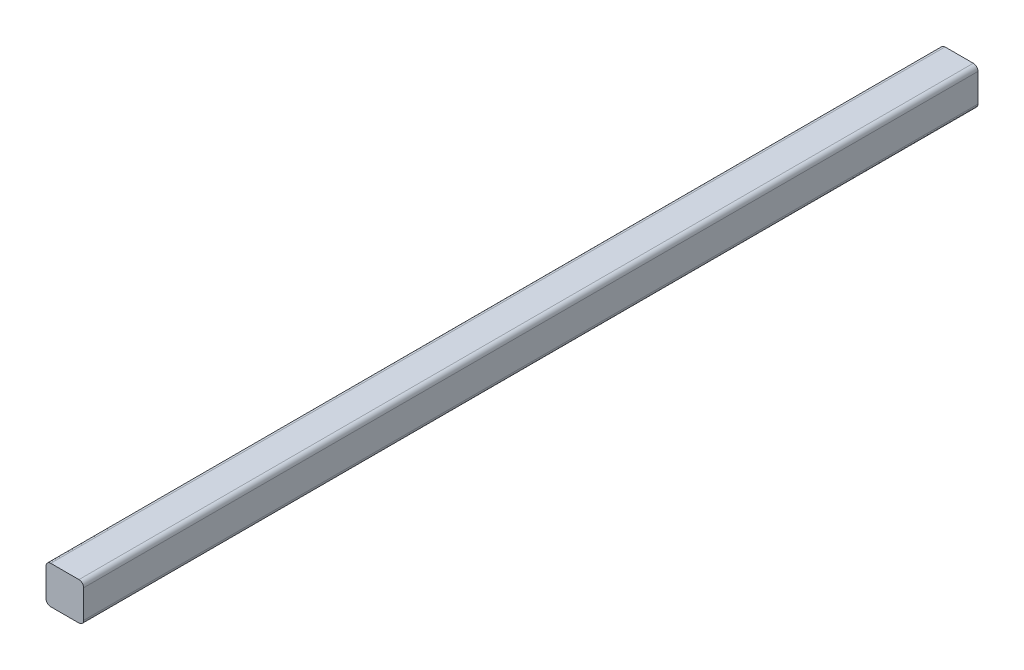
ISO-10303-21;
HEADER;
FILE_DESCRIPTION(('STEP AP214'),'2;1');
FILE_NAME('part.step','',(''),(''),'','','');
FILE_SCHEMA(('AUTOMOTIVE_DESIGN { 1 0 10303 214 1 1 1 1 }'));
ENDSEC;
DATA;
#1=APPLICATION_CONTEXT('core data for automotive mechanical design processes');
#2=APPLICATION_PROTOCOL_DEFINITION('international standard','automotive_design',2000,#1);
#3=PRODUCT_CONTEXT('',#1,'mechanical');
#4=PRODUCT('Part','Part','',(#3));
#5=PRODUCT_RELATED_PRODUCT_CATEGORY('part','',(#4));
#6=PRODUCT_DEFINITION_FORMATION('','',#4);
#7=PRODUCT_DEFINITION_CONTEXT('part definition',#1,'design');
#8=PRODUCT_DEFINITION('design','',#6,#7);
#9=PRODUCT_DEFINITION_SHAPE('','',#8);
#10=(LENGTH_UNIT() NAMED_UNIT(*) SI_UNIT(.MILLI.,.METRE.));
#11=(NAMED_UNIT(*) PLANE_ANGLE_UNIT() SI_UNIT($,.RADIAN.));
#12=(NAMED_UNIT(*) SI_UNIT($,.STERADIAN.) SOLID_ANGLE_UNIT());
#13=UNCERTAINTY_MEASURE_WITH_UNIT(LENGTH_MEASURE(1.E-05),#10,'distance_accuracy_value','');
#14=(GEOMETRIC_REPRESENTATION_CONTEXT(3) GLOBAL_UNCERTAINTY_ASSIGNED_CONTEXT((#13)) GLOBAL_UNIT_ASSIGNED_CONTEXT((#10,
#11,#12)) REPRESENTATION_CONTEXT('',''));
#15=CARTESIAN_POINT('',(0.,0.,0.));
#16=DIRECTION('',(0.,0.,1.));
#17=DIRECTION('',(1.,0.,0.));
#18=AXIS2_PLACEMENT_3D('',#15,#16,#17);
#19=CARTESIAN_POINT('',(-2.,2.,95.));
#20=DIRECTION('',(1.,0.,0.));
#21=DIRECTION('',(0.,1.,0.));
#22=AXIS2_PLACEMENT_3D('',#19,#20,#21);
#23=PLANE('',#22);
#24=DIRECTION('',(0.,-1.,0.));
#25=VECTOR('',#24,1.);
#26=CARTESIAN_POINT('',(-2.,2.,0.));
#27=LINE('',#26,#25);
#28=CARTESIAN_POINT('',(-2.,1.5,0.));
#29=VERTEX_POINT('',#28);
#30=CARTESIAN_POINT('',(-2.,-1.5,0.));
#31=VERTEX_POINT('',#30);
#32=EDGE_CURVE('E156',#29,#31,#27,.T.);
#33=ORIENTED_EDGE('',*,*,#32,.T.);
#34=DIRECTION('',(0.,0.,-1.));
#35=VECTOR('',#34,1.);
#36=CARTESIAN_POINT('',(-2.,-1.5,95.));
#37=LINE('',#36,#35);
#38=CARTESIAN_POINT('',(-2.,-1.5,95.));
#39=VERTEX_POINT('',#38);
#40=EDGE_CURVE('E11',#31,#39,#37,.F.);
#41=ORIENTED_EDGE('',*,*,#40,.T.);
#42=DIRECTION('',(0.,-1.,0.));
#43=VECTOR('',#42,1.);
#44=CARTESIAN_POINT('',(-2.,2.,95.));
#45=LINE('',#44,#43);
#46=CARTESIAN_POINT('',(-2.,1.5,95.));
#47=VERTEX_POINT('',#46);
#48=EDGE_CURVE('E124',#47,#39,#45,.T.);
#49=ORIENTED_EDGE('',*,*,#48,.F.);
#50=DIRECTION('',(0.,0.,-1.));
#51=VECTOR('',#50,1.);
#52=CARTESIAN_POINT('',(-2.,1.5,95.));
#53=LINE('',#52,#51);
#54=EDGE_CURVE('E40',#47,#29,#53,.T.);
#55=ORIENTED_EDGE('',*,*,#54,.T.);
#56=EDGE_LOOP('',(#33,#41,#49,#55));
#57=FACE_BOUND('',#56,.T.);
#58=ADVANCED_FACE('F32',(#57),#23,.F.);
#59=CARTESIAN_POINT('',(-2.,-2.,95.));
#60=DIRECTION('',(0.,1.,0.));
#61=DIRECTION('',(0.,0.,1.));
#62=AXIS2_PLACEMENT_3D('',#59,#60,#61);
#63=PLANE('',#62);
#64=DIRECTION('',(1.,0.,0.));
#65=VECTOR('',#64,1.);
#66=CARTESIAN_POINT('',(-2.,-2.,0.));
#67=LINE('',#66,#65);
#68=CARTESIAN_POINT('',(-1.5,-2.,0.));
#69=VERTEX_POINT('',#68);
#70=CARTESIAN_POINT('',(1.5,-2.,0.));
#71=VERTEX_POINT('',#70);
#72=EDGE_CURVE('E129',#69,#71,#67,.T.);
#73=ORIENTED_EDGE('',*,*,#72,.T.);
#74=DIRECTION('',(0.,0.,-1.));
#75=VECTOR('',#74,1.);
#76=CARTESIAN_POINT('',(1.5,-2.,95.));
#77=LINE('',#76,#75);
#78=CARTESIAN_POINT('',(1.5,-2.,95.));
#79=VERTEX_POINT('',#78);
#80=EDGE_CURVE('E47',#71,#79,#77,.F.);
#81=ORIENTED_EDGE('',*,*,#80,.T.);
#82=DIRECTION('',(1.,0.,0.));
#83=VECTOR('',#82,1.);
#84=CARTESIAN_POINT('',(-2.,-2.,95.));
#85=LINE('',#84,#83);
#86=CARTESIAN_POINT('',(-1.5,-2.,95.));
#87=VERTEX_POINT('',#86);
#88=EDGE_CURVE('E127',#87,#79,#85,.T.);
#89=ORIENTED_EDGE('',*,*,#88,.F.);
#90=DIRECTION('',(0.,0.,-1.));
#91=VECTOR('',#90,1.);
#92=CARTESIAN_POINT('',(-1.5,-2.,95.));
#93=LINE('',#92,#91);
#94=EDGE_CURVE('E148',#87,#69,#93,.T.);
#95=ORIENTED_EDGE('',*,*,#94,.T.);
#96=EDGE_LOOP('',(#73,#81,#89,#95));
#97=FACE_BOUND('',#96,.T.);
#98=ADVANCED_FACE('F176',(#97),#63,.F.);
#99=CARTESIAN_POINT('',(2.,2.,95.));
#100=DIRECTION('',(-1.,0.,0.));
#101=DIRECTION('',(0.,0.,1.));
#102=AXIS2_PLACEMENT_3D('',#99,#100,#101);
#103=PLANE('',#102);
#104=DIRECTION('',(0.,1.,0.));
#105=VECTOR('',#104,1.);
#106=CARTESIAN_POINT('',(2.,2.,0.));
#107=LINE('',#106,#105);
#108=CARTESIAN_POINT('',(2.,-1.5,0.));
#109=VERTEX_POINT('',#108);
#110=CARTESIAN_POINT('',(2.,1.5,0.));
#111=VERTEX_POINT('',#110);
#112=EDGE_CURVE('E125',#109,#111,#107,.T.);
#113=ORIENTED_EDGE('',*,*,#112,.T.);
#114=DIRECTION('',(0.,0.,-1.));
#115=VECTOR('',#114,1.);
#116=CARTESIAN_POINT('',(2.,1.5,95.));
#117=LINE('',#116,#115);
#118=CARTESIAN_POINT('',(2.,1.5,95.));
#119=VERTEX_POINT('',#118);
#120=EDGE_CURVE('E103',#111,#119,#117,.F.);
#121=ORIENTED_EDGE('',*,*,#120,.T.);
#122=DIRECTION('',(0.,1.,0.));
#123=VECTOR('',#122,1.);
#124=CARTESIAN_POINT('',(2.,2.,95.));
#125=LINE('',#124,#123);
#126=CARTESIAN_POINT('',(2.,-1.5,95.));
#127=VERTEX_POINT('',#126);
#128=EDGE_CURVE('E164',#127,#119,#125,.T.);
#129=ORIENTED_EDGE('',*,*,#128,.F.);
#130=DIRECTION('',(0.,0.,-1.));
#131=VECTOR('',#130,1.);
#132=CARTESIAN_POINT('',(2.,-1.5,95.));
#133=LINE('',#132,#131);
#134=EDGE_CURVE('E108',#127,#109,#133,.T.);
#135=ORIENTED_EDGE('',*,*,#134,.T.);
#136=EDGE_LOOP('',(#113,#121,#129,#135));
#137=FACE_BOUND('',#136,.T.);
#138=ADVANCED_FACE('F175',(#137),#103,.F.);
#139=CARTESIAN_POINT('',(-2.,2.,95.));
#140=DIRECTION('',(0.,-1.,0.));
#141=DIRECTION('',(0.,0.,-1.));
#142=AXIS2_PLACEMENT_3D('',#139,#140,#141);
#143=PLANE('',#142);
#144=DIRECTION('',(-1.,0.,0.));
#145=VECTOR('',#144,1.);
#146=CARTESIAN_POINT('',(-2.,2.,95.));
#147=LINE('',#146,#145);
#148=CARTESIAN_POINT('',(1.5,2.,95.));
#149=VERTEX_POINT('',#148);
#150=CARTESIAN_POINT('',(-1.5,2.,95.));
#151=VERTEX_POINT('',#150);
#152=EDGE_CURVE('E118',#149,#151,#147,.T.);
#153=ORIENTED_EDGE('',*,*,#152,.F.);
#154=DIRECTION('',(0.,0.,-1.));
#155=VECTOR('',#154,1.);
#156=CARTESIAN_POINT('',(1.5,2.,95.));
#157=LINE('',#156,#155);
#158=CARTESIAN_POINT('',(1.5,2.,0.));
#159=VERTEX_POINT('',#158);
#160=EDGE_CURVE('E102',#149,#159,#157,.T.);
#161=ORIENTED_EDGE('',*,*,#160,.T.);
#162=DIRECTION('',(-1.,0.,0.));
#163=VECTOR('',#162,1.);
#164=CARTESIAN_POINT('',(-2.,2.,0.));
#165=LINE('',#164,#163);
#166=CARTESIAN_POINT('',(-1.5,2.,0.));
#167=VERTEX_POINT('',#166);
#168=EDGE_CURVE('E115',#159,#167,#165,.T.);
#169=ORIENTED_EDGE('',*,*,#168,.T.);
#170=DIRECTION('',(0.,0.,-1.));
#171=VECTOR('',#170,1.);
#172=CARTESIAN_POINT('',(-1.5,2.,95.));
#173=LINE('',#172,#171);
#174=EDGE_CURVE('E120',#167,#151,#173,.F.);
#175=ORIENTED_EDGE('',*,*,#174,.T.);
#176=EDGE_LOOP('',(#153,#161,#169,#175));
#177=FACE_BOUND('',#176,.T.);
#178=ADVANCED_FACE('F114',(#177),#143,.F.);
#179=CARTESIAN_POINT('',(0.,0.,95.));
#180=DIRECTION('',(0.,0.,1.));
#181=DIRECTION('',(1.,0.,0.));
#182=AXIS2_PLACEMENT_3D('',#179,#180,#181);
#183=PLANE('',#182);
#184=ORIENTED_EDGE('',*,*,#128,.T.);
#185=CARTESIAN_POINT('',(1.5,1.5,95.));
#186=DIRECTION('',(0.,0.,1.));
#187=DIRECTION('',(1.,0.,0.));
#188=AXIS2_PLACEMENT_3D('',#185,#186,#187);
#189=CIRCLE('',#188,0.5);
#190=EDGE_CURVE('E146',#119,#149,#189,.T.);
#191=ORIENTED_EDGE('',*,*,#190,.T.);
#192=ORIENTED_EDGE('',*,*,#152,.T.);
#193=CARTESIAN_POINT('',(-1.5,1.5,95.));
#194=DIRECTION('',(0.,0.,1.));
#195=DIRECTION('',(1.,0.,0.));
#196=AXIS2_PLACEMENT_3D('',#193,#194,#195);
#197=CIRCLE('',#196,0.5);
#198=EDGE_CURVE('E141',#151,#47,#197,.T.);
#199=ORIENTED_EDGE('',*,*,#198,.T.);
#200=ORIENTED_EDGE('',*,*,#48,.T.);
#201=CARTESIAN_POINT('',(-1.5,-1.5,95.));
#202=DIRECTION('',(0.,0.,1.));
#203=DIRECTION('',(1.,0.,0.));
#204=AXIS2_PLACEMENT_3D('',#201,#202,#203);
#205=CIRCLE('',#204,0.5);
#206=EDGE_CURVE('E54',#39,#87,#205,.T.);
#207=ORIENTED_EDGE('',*,*,#206,.T.);
#208=ORIENTED_EDGE('',*,*,#88,.T.);
#209=CARTESIAN_POINT('',(1.5,-1.5,95.));
#210=DIRECTION('',(0.,0.,1.));
#211=DIRECTION('',(1.,0.,0.));
#212=AXIS2_PLACEMENT_3D('',#209,#210,#211);
#213=CIRCLE('',#212,0.5);
#214=EDGE_CURVE('E144',#79,#127,#213,.T.);
#215=ORIENTED_EDGE('',*,*,#214,.T.);
#216=EDGE_LOOP('',(#184,#191,#192,#199,#200,#207,#208,#215));
#217=FACE_BOUND('',#216,.T.);
#218=ADVANCED_FACE('F168',(#217),#183,.T.);
#219=CARTESIAN_POINT('',(0.,0.,0.));
#220=DIRECTION('',(0.,0.,1.));
#221=DIRECTION('',(1.,0.,0.));
#222=AXIS2_PLACEMENT_3D('',#219,#220,#221);
#223=PLANE('',#222);
#224=ORIENTED_EDGE('',*,*,#168,.F.);
#225=CARTESIAN_POINT('',(1.5,1.5,0.));
#226=DIRECTION('',(0.,0.,1.));
#227=DIRECTION('',(1.,0.,0.));
#228=AXIS2_PLACEMENT_3D('',#225,#226,#227);
#229=CIRCLE('',#228,0.5);
#230=EDGE_CURVE('E98',#159,#111,#229,.F.);
#231=ORIENTED_EDGE('',*,*,#230,.T.);
#232=ORIENTED_EDGE('',*,*,#112,.F.);
#233=CARTESIAN_POINT('',(1.5,-1.5,0.));
#234=DIRECTION('',(0.,0.,1.));
#235=DIRECTION('',(1.,0.,0.));
#236=AXIS2_PLACEMENT_3D('',#233,#234,#235);
#237=CIRCLE('',#236,0.5);
#238=EDGE_CURVE('E109',#109,#71,#237,.F.);
#239=ORIENTED_EDGE('',*,*,#238,.T.);
#240=ORIENTED_EDGE('',*,*,#72,.F.);
#241=CARTESIAN_POINT('',(-1.5,-1.5,0.));
#242=DIRECTION('',(0.,0.,1.));
#243=DIRECTION('',(1.,0.,0.));
#244=AXIS2_PLACEMENT_3D('',#241,#242,#243);
#245=CIRCLE('',#244,0.5);
#246=EDGE_CURVE('E135',#69,#31,#245,.F.);
#247=ORIENTED_EDGE('',*,*,#246,.T.);
#248=ORIENTED_EDGE('',*,*,#32,.F.);
#249=CARTESIAN_POINT('',(-1.5,1.5,0.));
#250=DIRECTION('',(0.,0.,1.));
#251=DIRECTION('',(1.,0.,0.));
#252=AXIS2_PLACEMENT_3D('',#249,#250,#251);
#253=CIRCLE('',#252,0.5);
#254=EDGE_CURVE('E119',#29,#167,#253,.F.);
#255=ORIENTED_EDGE('',*,*,#254,.T.);
#256=EDGE_LOOP('',(#224,#231,#232,#239,#240,#247,#248,#255));
#257=FACE_BOUND('',#256,.T.);
#258=ADVANCED_FACE('F122',(#257),#223,.F.);
#259=CARTESIAN_POINT('',(1.5,1.5,95.));
#260=DIRECTION('',(0.,0.,-1.));
#261=DIRECTION('',(-1.,0.,0.));
#262=AXIS2_PLACEMENT_3D('',#259,#260,#261);
#263=CYLINDRICAL_SURFACE('',#262,0.5);
#264=ORIENTED_EDGE('',*,*,#190,.F.);
#265=ORIENTED_EDGE('',*,*,#120,.F.);
#266=ORIENTED_EDGE('',*,*,#230,.F.);
#267=ORIENTED_EDGE('',*,*,#160,.F.);
#268=EDGE_LOOP('',(#264,#265,#266,#267));
#269=FACE_BOUND('',#268,.T.);
#270=ADVANCED_FACE('F101',(#269),#263,.T.);
#271=CARTESIAN_POINT('',(1.5,-1.5,95.));
#272=DIRECTION('',(0.,0.,-1.));
#273=DIRECTION('',(-1.,0.,0.));
#274=AXIS2_PLACEMENT_3D('',#271,#272,#273);
#275=CYLINDRICAL_SURFACE('',#274,0.5);
#276=ORIENTED_EDGE('',*,*,#214,.F.);
#277=ORIENTED_EDGE('',*,*,#80,.F.);
#278=ORIENTED_EDGE('',*,*,#238,.F.);
#279=ORIENTED_EDGE('',*,*,#134,.F.);
#280=EDGE_LOOP('',(#276,#277,#278,#279));
#281=FACE_BOUND('',#280,.T.);
#282=ADVANCED_FACE('F173',(#281),#275,.T.);
#283=CARTESIAN_POINT('',(-1.5,-1.5,95.));
#284=DIRECTION('',(0.,0.,-1.));
#285=DIRECTION('',(-1.,0.,0.));
#286=AXIS2_PLACEMENT_3D('',#283,#284,#285);
#287=CYLINDRICAL_SURFACE('',#286,0.5);
#288=ORIENTED_EDGE('',*,*,#206,.F.);
#289=ORIENTED_EDGE('',*,*,#40,.F.);
#290=ORIENTED_EDGE('',*,*,#246,.F.);
#291=ORIENTED_EDGE('',*,*,#94,.F.);
#292=EDGE_LOOP('',(#288,#289,#290,#291));
#293=FACE_BOUND('',#292,.T.);
#294=ADVANCED_FACE('F178',(#293),#287,.T.);
#295=CARTESIAN_POINT('',(-1.5,1.5,95.));
#296=DIRECTION('',(0.,0.,-1.));
#297=DIRECTION('',(-1.,0.,0.));
#298=AXIS2_PLACEMENT_3D('',#295,#296,#297);
#299=CYLINDRICAL_SURFACE('',#298,0.5);
#300=ORIENTED_EDGE('',*,*,#198,.F.);
#301=ORIENTED_EDGE('',*,*,#174,.F.);
#302=ORIENTED_EDGE('',*,*,#254,.F.);
#303=ORIENTED_EDGE('',*,*,#54,.F.);
#304=EDGE_LOOP('',(#300,#301,#302,#303));
#305=FACE_BOUND('',#304,.T.);
#306=ADVANCED_FACE('F34',(#305),#299,.T.);
#307=CLOSED_SHELL('',(#58,#98,#138,#178,#218,#258,#270,#282,#294,#306));
#308=MANIFOLD_SOLID_BREP('B2',#307);
#309=ADVANCED_BREP_SHAPE_REPRESENTATION('',(#18,#308),#14);
#310=SHAPE_DEFINITION_REPRESENTATION(#9,#309);
ENDSEC;
END-ISO-10303-21;
